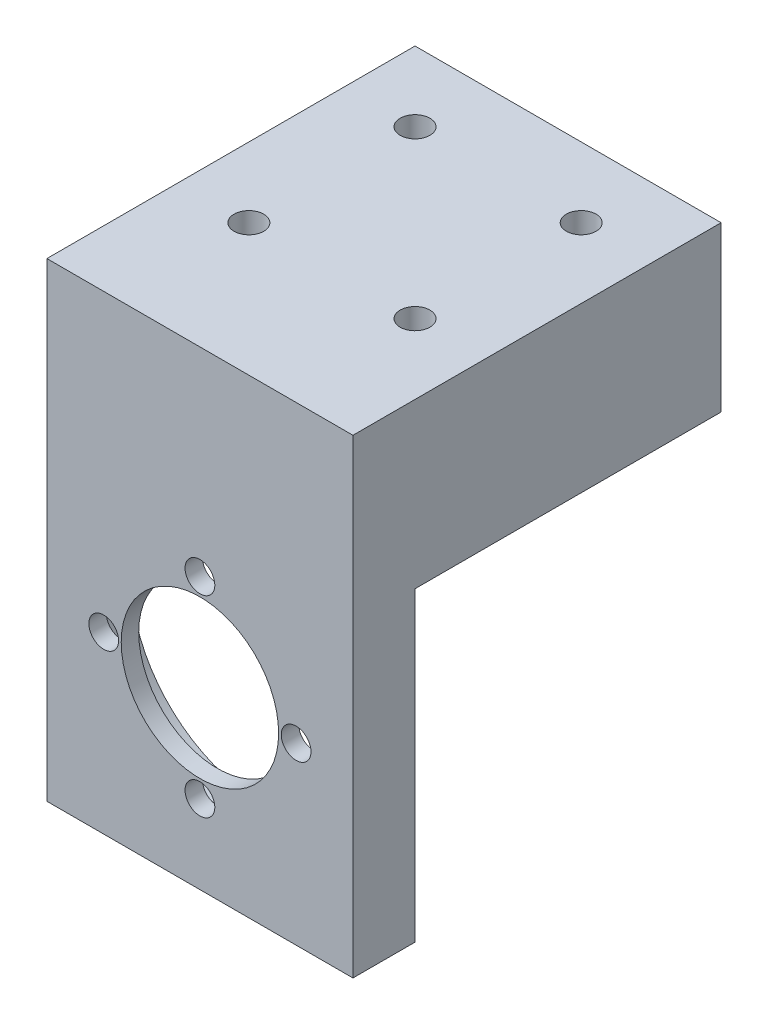
ISO-10303-21;
HEADER;
FILE_DESCRIPTION(('STEP AP214'),'2;1');
FILE_NAME('part.step','',(''),(''),'','','');
FILE_SCHEMA(('AUTOMOTIVE_DESIGN { 1 0 10303 214 1 1 1 1 }'));
ENDSEC;
DATA;
#1=APPLICATION_CONTEXT('core data for automotive mechanical design processes');
#2=APPLICATION_PROTOCOL_DEFINITION('international standard','automotive_design',2000,#1);
#3=PRODUCT_CONTEXT('',#1,'mechanical');
#4=PRODUCT('Part','Part','',(#3));
#5=PRODUCT_RELATED_PRODUCT_CATEGORY('part','',(#4));
#6=PRODUCT_DEFINITION_FORMATION('','',#4);
#7=PRODUCT_DEFINITION_CONTEXT('part definition',#1,'design');
#8=PRODUCT_DEFINITION('design','',#6,#7);
#9=PRODUCT_DEFINITION_SHAPE('','',#8);
#10=(LENGTH_UNIT() NAMED_UNIT(*) SI_UNIT(.MILLI.,.METRE.));
#11=(NAMED_UNIT(*) PLANE_ANGLE_UNIT() SI_UNIT($,.RADIAN.));
#12=(NAMED_UNIT(*) SI_UNIT($,.STERADIAN.) SOLID_ANGLE_UNIT());
#13=UNCERTAINTY_MEASURE_WITH_UNIT(LENGTH_MEASURE(1.E-05),#10,'distance_accuracy_value','');
#14=(GEOMETRIC_REPRESENTATION_CONTEXT(3) GLOBAL_UNCERTAINTY_ASSIGNED_CONTEXT((#13)) GLOBAL_UNIT_ASSIGNED_CONTEXT((#10,
#11,#12)) REPRESENTATION_CONTEXT('',''));
#15=CARTESIAN_POINT('',(0.,0.,0.));
#16=DIRECTION('',(0.,0.,1.));
#17=DIRECTION('',(1.,0.,0.));
#18=AXIS2_PLACEMENT_3D('',#15,#16,#17);
#19=CARTESIAN_POINT('',(35.,53.75,0.));
#20=DIRECTION('',(0.,0.,-1.));
#21=DIRECTION('',(-1.,0.,0.));
#22=AXIS2_PLACEMENT_3D('',#19,#20,#21);
#23=PLANE('',#22);
#24=CARTESIAN_POINT('',(6.5,20.,0.));
#25=DIRECTION('',(0.,0.,-1.));
#26=DIRECTION('',(-1.,0.,0.));
#27=AXIS2_PLACEMENT_3D('',#24,#25,#26);
#28=CIRCLE('',#27,1.69999999999999);
#29=CARTESIAN_POINT('',(4.80000000000001,20.,0.));
#30=VERTEX_POINT('',#29);
#31=EDGE_CURVE('E204',#30,#30,#28,.T.);
#32=ORIENTED_EDGE('',*,*,#31,.T.);
#33=EDGE_LOOP('',(#32));
#34=FACE_BOUND('',#33,.T.);
#35=CARTESIAN_POINT('',(17.5,20.,0.));
#36=DIRECTION('',(0.,0.,-1.));
#37=DIRECTION('',(-1.,0.,0.));
#38=AXIS2_PLACEMENT_3D('',#35,#36,#37);
#39=CIRCLE('',#38,9.);
#40=CARTESIAN_POINT('',(8.5,20.,0.));
#41=VERTEX_POINT('',#40);
#42=EDGE_CURVE('E253',#41,#41,#39,.T.);
#43=ORIENTED_EDGE('',*,*,#42,.T.);
#44=EDGE_LOOP('',(#43));
#45=FACE_BOUND('',#44,.T.);
#46=CARTESIAN_POINT('',(17.5,31.,0.));
#47=DIRECTION('',(0.,0.,-1.));
#48=DIRECTION('',(-1.,0.,0.));
#49=AXIS2_PLACEMENT_3D('',#46,#47,#48);
#50=CIRCLE('',#49,1.7);
#51=CARTESIAN_POINT('',(15.8,31.,0.));
#52=VERTEX_POINT('',#51);
#53=EDGE_CURVE('E249',#52,#52,#50,.T.);
#54=ORIENTED_EDGE('',*,*,#53,.T.);
#55=EDGE_LOOP('',(#54));
#56=FACE_BOUND('',#55,.T.);
#57=CARTESIAN_POINT('',(28.5,20.,0.));
#58=DIRECTION('',(0.,0.,-1.));
#59=DIRECTION('',(-1.,0.,0.));
#60=AXIS2_PLACEMENT_3D('',#57,#58,#59);
#61=CIRCLE('',#60,1.7);
#62=CARTESIAN_POINT('',(26.8,20.,0.));
#63=VERTEX_POINT('',#62);
#64=EDGE_CURVE('E243',#63,#63,#61,.T.);
#65=ORIENTED_EDGE('',*,*,#64,.T.);
#66=EDGE_LOOP('',(#65));
#67=FACE_BOUND('',#66,.T.);
#68=CARTESIAN_POINT('',(17.5,9.,0.));
#69=DIRECTION('',(0.,0.,-1.));
#70=DIRECTION('',(-1.,0.,0.));
#71=AXIS2_PLACEMENT_3D('',#68,#69,#70);
#72=CIRCLE('',#71,1.7);
#73=CARTESIAN_POINT('',(15.8,9.,0.));
#74=VERTEX_POINT('',#73);
#75=EDGE_CURVE('E248',#74,#74,#72,.T.);
#76=ORIENTED_EDGE('',*,*,#75,.T.);
#77=EDGE_LOOP('',(#76));
#78=FACE_BOUND('',#77,.T.);
#79=DIRECTION('',(0.,-1.,0.));
#80=VECTOR('',#79,1.);
#81=CARTESIAN_POINT('',(0.,53.75,0.));
#82=LINE('',#81,#80);
#83=CARTESIAN_POINT('',(0.,53.75,0.));
#84=VERTEX_POINT('',#83);
#85=CARTESIAN_POINT('',(0.,0.,0.));
#86=VERTEX_POINT('',#85);
#87=EDGE_CURVE('E199',#84,#86,#82,.T.);
#88=ORIENTED_EDGE('',*,*,#87,.T.);
#89=DIRECTION('',(-1.,0.,0.));
#90=VECTOR('',#89,1.);
#91=CARTESIAN_POINT('',(35.,0.,0.));
#92=LINE('',#91,#90);
#93=CARTESIAN_POINT('',(35.,0.,0.));
#94=VERTEX_POINT('',#93);
#95=EDGE_CURVE('E12',#94,#86,#92,.T.);
#96=ORIENTED_EDGE('',*,*,#95,.F.);
#97=DIRECTION('',(0.,-1.,0.));
#98=VECTOR('',#97,1.);
#99=CARTESIAN_POINT('',(35.,53.75,0.));
#100=LINE('',#99,#98);
#101=CARTESIAN_POINT('',(35.,53.75,0.));
#102=VERTEX_POINT('',#101);
#103=EDGE_CURVE('E218',#102,#94,#100,.T.);
#104=ORIENTED_EDGE('',*,*,#103,.F.);
#105=DIRECTION('',(-1.,0.,0.));
#106=VECTOR('',#105,1.);
#107=CARTESIAN_POINT('',(35.,53.75,0.));
#108=LINE('',#107,#106);
#109=EDGE_CURVE('E195',#102,#84,#108,.T.);
#110=ORIENTED_EDGE('',*,*,#109,.T.);
#111=EDGE_LOOP('',(#88,#96,#104,#110));
#112=FACE_BOUND('',#111,.T.);
#113=ADVANCED_FACE('F105',(#34,#45,#56,#67,#78,#112),#23,.F.);
#114=CARTESIAN_POINT('',(35.,0.,0.));
#115=DIRECTION('',(0.,1.,0.));
#116=DIRECTION('',(0.,0.,1.));
#117=AXIS2_PLACEMENT_3D('',#114,#115,#116);
#118=PLANE('',#117);
#119=DIRECTION('',(0.,0.,-1.));
#120=VECTOR('',#119,1.);
#121=CARTESIAN_POINT('',(0.,0.,0.));
#122=LINE('',#121,#120);
#123=CARTESIAN_POINT('',(0.,0.,-7.1));
#124=VERTEX_POINT('',#123);
#125=EDGE_CURVE('E203',#86,#124,#122,.T.);
#126=ORIENTED_EDGE('',*,*,#125,.T.);
#127=DIRECTION('',(-1.,0.,0.));
#128=VECTOR('',#127,1.);
#129=CARTESIAN_POINT('',(35.,0.,-7.1));
#130=LINE('',#129,#128);
#131=CARTESIAN_POINT('',(35.,0.,-7.1));
#132=VERTEX_POINT('',#131);
#133=EDGE_CURVE('E113',#132,#124,#130,.T.);
#134=ORIENTED_EDGE('',*,*,#133,.F.);
#135=DIRECTION('',(0.,0.,-1.));
#136=VECTOR('',#135,1.);
#137=CARTESIAN_POINT('',(35.,0.,0.));
#138=LINE('',#137,#136);
#139=EDGE_CURVE('E160',#94,#132,#138,.T.);
#140=ORIENTED_EDGE('',*,*,#139,.F.);
#141=ORIENTED_EDGE('',*,*,#95,.T.);
#142=EDGE_LOOP('',(#126,#134,#140,#141));
#143=FACE_BOUND('',#142,.T.);
#144=ADVANCED_FACE('F349',(#143),#118,.F.);
#145=CARTESIAN_POINT('',(35.,0.,-7.1));
#146=DIRECTION('',(0.,0.,1.));
#147=DIRECTION('',(1.,0.,0.));
#148=AXIS2_PLACEMENT_3D('',#145,#146,#147);
#149=PLANE('',#148);
#150=DIRECTION('',(-1.,0.,0.));
#151=VECTOR('',#150,1.);
#152=CARTESIAN_POINT('',(35.,35.,-7.1));
#153=LINE('',#152,#151);
#154=CARTESIAN_POINT('',(17.5,35.,-7.1));
#155=VERTEX_POINT('',#154);
#156=CARTESIAN_POINT('',(0.,35.,-7.1));
#157=VERTEX_POINT('',#156);
#158=EDGE_CURVE('E188',#155,#157,#153,.T.);
#159=ORIENTED_EDGE('',*,*,#158,.F.);
#160=CARTESIAN_POINT('',(17.5,20.,-7.1));
#161=DIRECTION('',(0.,0.,1.));
#162=DIRECTION('',(1.,0.,0.));
#163=AXIS2_PLACEMENT_3D('',#160,#161,#162);
#164=CIRCLE('',#163,15.);
#165=EDGE_CURVE('E118',#155,#155,#164,.T.);
#166=ORIENTED_EDGE('',*,*,#165,.T.);
#167=CARTESIAN_POINT('',(35.,35.,-7.1));
#168=VERTEX_POINT('',#167);
#169=EDGE_CURVE('E223',#168,#155,#153,.T.);
#170=ORIENTED_EDGE('',*,*,#169,.F.);
#171=DIRECTION('',(0.,1.,0.));
#172=VECTOR('',#171,1.);
#173=CARTESIAN_POINT('',(35.,0.,-7.1));
#174=LINE('',#173,#172);
#175=EDGE_CURVE('E174',#132,#168,#174,.T.);
#176=ORIENTED_EDGE('',*,*,#175,.F.);
#177=ORIENTED_EDGE('',*,*,#133,.T.);
#178=DIRECTION('',(0.,1.,0.));
#179=VECTOR('',#178,1.);
#180=CARTESIAN_POINT('',(0.,0.,-7.1));
#181=LINE('',#180,#179);
#182=EDGE_CURVE('E207',#124,#157,#181,.T.);
#183=ORIENTED_EDGE('',*,*,#182,.T.);
#184=EDGE_LOOP('',(#159,#166,#170,#176,#177,#183));
#185=FACE_BOUND('',#184,.T.);
#186=ADVANCED_FACE('F230',(#185),#149,.F.);
#187=CARTESIAN_POINT('',(35.,35.,-7.1));
#188=DIRECTION('',(0.,1.,0.));
#189=DIRECTION('',(0.,0.,1.));
#190=AXIS2_PLACEMENT_3D('',#187,#188,#189);
#191=PLANE('',#190);
#192=CARTESIAN_POINT('',(8.,35.,-34.1));
#193=DIRECTION('',(0.,-1.,0.));
#194=DIRECTION('',(0.,0.,1.));
#195=AXIS2_PLACEMENT_3D('',#192,#193,#194);
#196=CIRCLE('',#195,1.7);
#197=CARTESIAN_POINT('',(8.,35.,-32.4));
#198=VERTEX_POINT('',#197);
#199=EDGE_CURVE('E302',#198,#198,#196,.T.);
#200=ORIENTED_EDGE('',*,*,#199,.F.);
#201=EDGE_LOOP('',(#200));
#202=FACE_BOUND('',#201,.T.);
#203=CARTESIAN_POINT('',(27.,35.,-34.1));
#204=DIRECTION('',(0.,-1.,0.));
#205=DIRECTION('',(0.,0.,-1.));
#206=AXIS2_PLACEMENT_3D('',#203,#204,#205);
#207=CIRCLE('',#206,1.7);
#208=CARTESIAN_POINT('',(27.,35.,-35.8));
#209=VERTEX_POINT('',#208);
#210=EDGE_CURVE('E310',#209,#209,#207,.T.);
#211=ORIENTED_EDGE('',*,*,#210,.F.);
#212=EDGE_LOOP('',(#211));
#213=FACE_BOUND('',#212,.T.);
#214=CARTESIAN_POINT('',(27.,35.,-15.1));
#215=DIRECTION('',(0.,-1.,0.));
#216=DIRECTION('',(0.,0.,1.));
#217=AXIS2_PLACEMENT_3D('',#214,#215,#216);
#218=CIRCLE('',#217,1.7);
#219=CARTESIAN_POINT('',(27.,35.,-13.4));
#220=VERTEX_POINT('',#219);
#221=EDGE_CURVE('E294',#220,#220,#218,.T.);
#222=ORIENTED_EDGE('',*,*,#221,.F.);
#223=EDGE_LOOP('',(#222));
#224=FACE_BOUND('',#223,.T.);
#225=CARTESIAN_POINT('',(8.,35.,-15.1));
#226=DIRECTION('',(0.,-1.,0.));
#227=DIRECTION('',(0.,0.,-1.));
#228=AXIS2_PLACEMENT_3D('',#225,#226,#227);
#229=CIRCLE('',#228,1.7);
#230=CARTESIAN_POINT('',(8.,35.,-16.8));
#231=VERTEX_POINT('',#230);
#232=EDGE_CURVE('E290',#231,#231,#229,.T.);
#233=ORIENTED_EDGE('',*,*,#232,.F.);
#234=EDGE_LOOP('',(#233));
#235=FACE_BOUND('',#234,.T.);
#236=DIRECTION('',(0.,0.,-1.));
#237=VECTOR('',#236,1.);
#238=CARTESIAN_POINT('',(0.,35.,-7.1));
#239=LINE('',#238,#237);
#240=CARTESIAN_POINT('',(0.,35.,-42.1));
#241=VERTEX_POINT('',#240);
#242=EDGE_CURVE('E184',#157,#241,#239,.T.);
#243=ORIENTED_EDGE('',*,*,#242,.T.);
#244=DIRECTION('',(-1.,0.,0.));
#245=VECTOR('',#244,1.);
#246=CARTESIAN_POINT('',(35.,35.,-42.1));
#247=LINE('',#246,#245);
#248=CARTESIAN_POINT('',(35.,35.,-42.1));
#249=VERTEX_POINT('',#248);
#250=EDGE_CURVE('E181',#249,#241,#247,.T.);
#251=ORIENTED_EDGE('',*,*,#250,.F.);
#252=DIRECTION('',(0.,0.,-1.));
#253=VECTOR('',#252,1.);
#254=CARTESIAN_POINT('',(35.,35.,-7.1));
#255=LINE('',#254,#253);
#256=EDGE_CURVE('E167',#168,#249,#255,.T.);
#257=ORIENTED_EDGE('',*,*,#256,.F.);
#258=ORIENTED_EDGE('',*,*,#169,.T.);
#259=ORIENTED_EDGE('',*,*,#158,.T.);
#260=EDGE_LOOP('',(#243,#251,#257,#258,#259));
#261=FACE_BOUND('',#260,.T.);
#262=ADVANCED_FACE('F182',(#202,#213,#224,#235,#261),#191,.F.);
#263=CARTESIAN_POINT('',(35.,35.,-42.1));
#264=DIRECTION('',(0.,0.,1.));
#265=DIRECTION('',(1.,0.,0.));
#266=AXIS2_PLACEMENT_3D('',#263,#264,#265);
#267=PLANE('',#266);
#268=DIRECTION('',(0.,1.,0.));
#269=VECTOR('',#268,1.);
#270=CARTESIAN_POINT('',(0.,35.,-42.1));
#271=LINE('',#270,#269);
#272=CARTESIAN_POINT('',(0.,53.75,-42.1));
#273=VERTEX_POINT('',#272);
#274=EDGE_CURVE('E213',#241,#273,#271,.T.);
#275=ORIENTED_EDGE('',*,*,#274,.T.);
#276=DIRECTION('',(-1.,0.,0.));
#277=VECTOR('',#276,1.);
#278=CARTESIAN_POINT('',(35.,53.75,-42.1));
#279=LINE('',#278,#277);
#280=CARTESIAN_POINT('',(35.,53.75,-42.1));
#281=VERTEX_POINT('',#280);
#282=EDGE_CURVE('E189',#281,#273,#279,.T.);
#283=ORIENTED_EDGE('',*,*,#282,.F.);
#284=DIRECTION('',(0.,1.,0.));
#285=VECTOR('',#284,1.);
#286=CARTESIAN_POINT('',(35.,35.,-42.1));
#287=LINE('',#286,#285);
#288=EDGE_CURVE('E171',#249,#281,#287,.T.);
#289=ORIENTED_EDGE('',*,*,#288,.F.);
#290=ORIENTED_EDGE('',*,*,#250,.T.);
#291=EDGE_LOOP('',(#275,#283,#289,#290));
#292=FACE_BOUND('',#291,.T.);
#293=ADVANCED_FACE('F191',(#292),#267,.F.);
#294=CARTESIAN_POINT('',(35.,53.75,-42.1));
#295=DIRECTION('',(0.,-1.,0.));
#296=DIRECTION('',(0.,0.,-1.));
#297=AXIS2_PLACEMENT_3D('',#294,#295,#296);
#298=PLANE('',#297);
#299=CARTESIAN_POINT('',(8.,53.75,-34.1));
#300=DIRECTION('',(0.,-1.,0.));
#301=DIRECTION('',(0.,0.,1.));
#302=AXIS2_PLACEMENT_3D('',#299,#300,#301);
#303=CIRCLE('',#302,1.7);
#304=CARTESIAN_POINT('',(8.,53.75,-32.4));
#305=VERTEX_POINT('',#304);
#306=EDGE_CURVE('E298',#305,#305,#303,.T.);
#307=ORIENTED_EDGE('',*,*,#306,.T.);
#308=EDGE_LOOP('',(#307));
#309=FACE_BOUND('',#308,.T.);
#310=CARTESIAN_POINT('',(27.,53.75,-34.1));
#311=DIRECTION('',(0.,-1.,0.));
#312=DIRECTION('',(0.,0.,-1.));
#313=AXIS2_PLACEMENT_3D('',#310,#311,#312);
#314=CIRCLE('',#313,1.7);
#315=CARTESIAN_POINT('',(27.,53.75,-35.8));
#316=VERTEX_POINT('',#315);
#317=EDGE_CURVE('E306',#316,#316,#314,.T.);
#318=ORIENTED_EDGE('',*,*,#317,.T.);
#319=EDGE_LOOP('',(#318));
#320=FACE_BOUND('',#319,.T.);
#321=CARTESIAN_POINT('',(27.,53.75,-15.1));
#322=DIRECTION('',(0.,-1.,0.));
#323=DIRECTION('',(0.,0.,1.));
#324=AXIS2_PLACEMENT_3D('',#321,#322,#323);
#325=CIRCLE('',#324,1.7);
#326=CARTESIAN_POINT('',(27.,53.75,-13.4));
#327=VERTEX_POINT('',#326);
#328=EDGE_CURVE('E314',#327,#327,#325,.T.);
#329=ORIENTED_EDGE('',*,*,#328,.T.);
#330=EDGE_LOOP('',(#329));
#331=FACE_BOUND('',#330,.T.);
#332=CARTESIAN_POINT('',(8.,53.75,-15.1));
#333=DIRECTION('',(0.,-1.,0.));
#334=DIRECTION('',(0.,0.,-1.));
#335=AXIS2_PLACEMENT_3D('',#332,#333,#334);
#336=CIRCLE('',#335,1.7);
#337=CARTESIAN_POINT('',(8.,53.75,-16.8));
#338=VERTEX_POINT('',#337);
#339=EDGE_CURVE('E289',#338,#338,#336,.T.);
#340=ORIENTED_EDGE('',*,*,#339,.T.);
#341=EDGE_LOOP('',(#340));
#342=FACE_BOUND('',#341,.T.);
#343=DIRECTION('',(0.,0.,1.));
#344=VECTOR('',#343,1.);
#345=CARTESIAN_POINT('',(0.,53.75,-42.1));
#346=LINE('',#345,#344);
#347=EDGE_CURVE('E152',#273,#84,#346,.T.);
#348=ORIENTED_EDGE('',*,*,#347,.T.);
#349=ORIENTED_EDGE('',*,*,#109,.F.);
#350=DIRECTION('',(0.,0.,1.));
#351=VECTOR('',#350,1.);
#352=CARTESIAN_POINT('',(35.,53.75,-42.1));
#353=LINE('',#352,#351);
#354=EDGE_CURVE('E126',#281,#102,#353,.T.);
#355=ORIENTED_EDGE('',*,*,#354,.F.);
#356=ORIENTED_EDGE('',*,*,#282,.T.);
#357=EDGE_LOOP('',(#348,#349,#355,#356));
#358=FACE_BOUND('',#357,.T.);
#359=ADVANCED_FACE('F234',(#309,#320,#331,#342,#358),#298,.F.);
#360=CARTESIAN_POINT('',(35.,0.,0.));
#361=DIRECTION('',(1.,0.,0.));
#362=DIRECTION('',(0.,0.,-1.));
#363=AXIS2_PLACEMENT_3D('',#360,#361,#362);
#364=PLANE('',#363);
#365=ORIENTED_EDGE('',*,*,#103,.T.);
#366=ORIENTED_EDGE('',*,*,#139,.T.);
#367=ORIENTED_EDGE('',*,*,#175,.T.);
#368=ORIENTED_EDGE('',*,*,#256,.T.);
#369=ORIENTED_EDGE('',*,*,#288,.T.);
#370=ORIENTED_EDGE('',*,*,#354,.T.);
#371=EDGE_LOOP('',(#365,#366,#367,#368,#369,#370));
#372=FACE_BOUND('',#371,.T.);
#373=ADVANCED_FACE('F169',(#372),#364,.T.);
#374=CARTESIAN_POINT('',(0.,0.,0.));
#375=DIRECTION('',(1.,0.,0.));
#376=DIRECTION('',(0.,0.,-1.));
#377=AXIS2_PLACEMENT_3D('',#374,#375,#376);
#378=PLANE('',#377);
#379=ORIENTED_EDGE('',*,*,#87,.F.);
#380=ORIENTED_EDGE('',*,*,#347,.F.);
#381=ORIENTED_EDGE('',*,*,#274,.F.);
#382=ORIENTED_EDGE('',*,*,#242,.F.);
#383=ORIENTED_EDGE('',*,*,#182,.F.);
#384=ORIENTED_EDGE('',*,*,#125,.F.);
#385=EDGE_LOOP('',(#379,#380,#381,#382,#383,#384));
#386=FACE_BOUND('',#385,.T.);
#387=ADVANCED_FACE('F233',(#386),#378,.F.);
#388=CARTESIAN_POINT('',(17.5,9.,25.4558441227157));
#389=DIRECTION('',(0.,0.,-1.));
#390=DIRECTION('',(-1.,0.,0.));
#391=AXIS2_PLACEMENT_3D('',#388,#389,#390);
#392=CYLINDRICAL_SURFACE('',#391,1.7);
#393=CARTESIAN_POINT('',(17.5,9.,-2.));
#394=DIRECTION('',(0.,0.,1.));
#395=DIRECTION('',(1.,0.,0.));
#396=AXIS2_PLACEMENT_3D('',#393,#394,#395);
#397=CIRCLE('',#396,1.7);
#398=CARTESIAN_POINT('',(19.2,9.,-2.));
#399=VERTEX_POINT('',#398);
#400=EDGE_CURVE('E281',#399,#399,#397,.T.);
#401=ORIENTED_EDGE('',*,*,#400,.F.);
#402=EDGE_LOOP('',(#401));
#403=FACE_BOUND('',#402,.T.);
#404=ORIENTED_EDGE('',*,*,#75,.F.);
#405=EDGE_LOOP('',(#404));
#406=FACE_BOUND('',#405,.T.);
#407=ADVANCED_FACE('F366',(#403,#406),#392,.F.);
#408=CARTESIAN_POINT('',(28.5,20.,25.4558441227157));
#409=DIRECTION('',(0.,0.,-1.));
#410=DIRECTION('',(-1.,0.,0.));
#411=AXIS2_PLACEMENT_3D('',#408,#409,#410);
#412=CYLINDRICAL_SURFACE('',#411,1.7);
#413=CARTESIAN_POINT('',(28.5,20.,-2.));
#414=DIRECTION('',(0.,0.,1.));
#415=DIRECTION('',(1.,0.,0.));
#416=AXIS2_PLACEMENT_3D('',#413,#414,#415);
#417=CIRCLE('',#416,1.7);
#418=CARTESIAN_POINT('',(30.2,20.,-2.));
#419=VERTEX_POINT('',#418);
#420=EDGE_CURVE('E277',#419,#419,#417,.T.);
#421=ORIENTED_EDGE('',*,*,#420,.F.);
#422=EDGE_LOOP('',(#421));
#423=FACE_BOUND('',#422,.T.);
#424=ORIENTED_EDGE('',*,*,#64,.F.);
#425=EDGE_LOOP('',(#424));
#426=FACE_BOUND('',#425,.T.);
#427=ADVANCED_FACE('F368',(#423,#426),#412,.F.);
#428=CARTESIAN_POINT('',(17.5,31.,25.4558441227157));
#429=DIRECTION('',(0.,0.,-1.));
#430=DIRECTION('',(-1.,0.,0.));
#431=AXIS2_PLACEMENT_3D('',#428,#429,#430);
#432=CYLINDRICAL_SURFACE('',#431,1.7);
#433=CARTESIAN_POINT('',(17.5,31.,-2.));
#434=DIRECTION('',(0.,0.,1.));
#435=DIRECTION('',(1.,0.,0.));
#436=AXIS2_PLACEMENT_3D('',#433,#434,#435);
#437=CIRCLE('',#436,1.7);
#438=CARTESIAN_POINT('',(19.2,31.,-2.));
#439=VERTEX_POINT('',#438);
#440=EDGE_CURVE('E273',#439,#439,#437,.T.);
#441=ORIENTED_EDGE('',*,*,#440,.F.);
#442=EDGE_LOOP('',(#441));
#443=FACE_BOUND('',#442,.T.);
#444=ORIENTED_EDGE('',*,*,#53,.F.);
#445=EDGE_LOOP('',(#444));
#446=FACE_BOUND('',#445,.T.);
#447=ADVANCED_FACE('F375',(#443,#446),#432,.F.);
#448=CARTESIAN_POINT('',(17.5,20.,25.4558441227157));
#449=DIRECTION('',(0.,0.,-1.));
#450=DIRECTION('',(-1.,0.,0.));
#451=AXIS2_PLACEMENT_3D('',#448,#449,#450);
#452=CYLINDRICAL_SURFACE('',#451,9.);
#453=CARTESIAN_POINT('',(17.5,20.,-2.));
#454=DIRECTION('',(0.,0.,1.));
#455=DIRECTION('',(1.,0.,0.));
#456=AXIS2_PLACEMENT_3D('',#453,#454,#455);
#457=CIRCLE('',#456,9.);
#458=CARTESIAN_POINT('',(26.5,20.,-2.));
#459=VERTEX_POINT('',#458);
#460=EDGE_CURVE('E269',#459,#459,#457,.T.);
#461=ORIENTED_EDGE('',*,*,#460,.F.);
#462=EDGE_LOOP('',(#461));
#463=FACE_BOUND('',#462,.T.);
#464=ORIENTED_EDGE('',*,*,#42,.F.);
#465=EDGE_LOOP('',(#464));
#466=FACE_BOUND('',#465,.T.);
#467=ADVANCED_FACE('F381',(#463,#466),#452,.F.);
#468=CARTESIAN_POINT('',(6.5,20.,25.4558441227157));
#469=DIRECTION('',(0.,0.,-1.));
#470=DIRECTION('',(-1.,0.,0.));
#471=AXIS2_PLACEMENT_3D('',#468,#469,#470);
#472=CYLINDRICAL_SURFACE('',#471,1.69999999999999);
#473=CARTESIAN_POINT('',(6.5,20.,-2.));
#474=DIRECTION('',(0.,0.,1.));
#475=DIRECTION('',(1.,0.,0.));
#476=AXIS2_PLACEMENT_3D('',#473,#474,#475);
#477=CIRCLE('',#476,1.69999999999999);
#478=CARTESIAN_POINT('',(8.2,20.,-2.));
#479=VERTEX_POINT('',#478);
#480=EDGE_CURVE('E285',#479,#479,#477,.T.);
#481=ORIENTED_EDGE('',*,*,#480,.F.);
#482=EDGE_LOOP('',(#481));
#483=FACE_BOUND('',#482,.T.);
#484=ORIENTED_EDGE('',*,*,#31,.F.);
#485=EDGE_LOOP('',(#484));
#486=FACE_BOUND('',#485,.T.);
#487=ADVANCED_FACE('F447',(#483,#486),#472,.F.);
#488=CARTESIAN_POINT('',(17.5,20.,-84.5264068711928));
#489=DIRECTION('',(0.,0.,1.));
#490=DIRECTION('',(1.,0.,0.));
#491=AXIS2_PLACEMENT_3D('',#488,#489,#490);
#492=CYLINDRICAL_SURFACE('',#491,15.);
#493=CARTESIAN_POINT('',(17.5,20.,-2.));
#494=DIRECTION('',(0.,0.,1.));
#495=DIRECTION('',(1.,0.,0.));
#496=AXIS2_PLACEMENT_3D('',#493,#494,#495);
#497=CIRCLE('',#496,15.);
#498=CARTESIAN_POINT('',(32.5,20.,-2.));
#499=VERTEX_POINT('',#498);
#500=EDGE_CURVE('E265',#499,#499,#497,.T.);
#501=ORIENTED_EDGE('',*,*,#500,.T.);
#502=EDGE_LOOP('',(#501));
#503=FACE_BOUND('',#502,.T.);
#504=ORIENTED_EDGE('',*,*,#165,.F.);
#505=EDGE_LOOP('',(#504));
#506=FACE_BOUND('',#505,.T.);
#507=ADVANCED_FACE('F343',(#503,#506),#492,.F.);
#508=CARTESIAN_POINT('',(17.5,20.,-2.));
#509=DIRECTION('',(0.,0.,1.));
#510=DIRECTION('',(1.,0.,0.));
#511=AXIS2_PLACEMENT_3D('',#508,#509,#510);
#512=PLANE('',#511);
#513=ORIENTED_EDGE('',*,*,#400,.T.);
#514=EDGE_LOOP('',(#513));
#515=FACE_BOUND('',#514,.T.);
#516=ORIENTED_EDGE('',*,*,#440,.T.);
#517=EDGE_LOOP('',(#516));
#518=FACE_BOUND('',#517,.T.);
#519=ORIENTED_EDGE('',*,*,#500,.F.);
#520=EDGE_LOOP('',(#519));
#521=FACE_BOUND('',#520,.T.);
#522=ORIENTED_EDGE('',*,*,#460,.T.);
#523=EDGE_LOOP('',(#522));
#524=FACE_BOUND('',#523,.T.);
#525=ORIENTED_EDGE('',*,*,#420,.T.);
#526=EDGE_LOOP('',(#525));
#527=FACE_BOUND('',#526,.T.);
#528=ORIENTED_EDGE('',*,*,#480,.T.);
#529=EDGE_LOOP('',(#528));
#530=FACE_BOUND('',#529,.T.);
#531=ADVANCED_FACE('F332',(#515,#518,#521,#524,#527,#530),#512,.F.);
#532=CARTESIAN_POINT('',(8.,53.75,-15.1));
#533=DIRECTION('',(0.,-1.,0.));
#534=DIRECTION('',(0.,0.,-1.));
#535=AXIS2_PLACEMENT_3D('',#532,#533,#534);
#536=CYLINDRICAL_SURFACE('',#535,1.7);
#537=ORIENTED_EDGE('',*,*,#339,.F.);
#538=EDGE_LOOP('',(#537));
#539=FACE_BOUND('',#538,.T.);
#540=ORIENTED_EDGE('',*,*,#232,.T.);
#541=EDGE_LOOP('',(#540));
#542=FACE_BOUND('',#541,.T.);
#543=ADVANCED_FACE('F330',(#539,#542),#536,.F.);
#544=CARTESIAN_POINT('',(27.,53.75,-15.1));
#545=DIRECTION('',(0.,-1.,0.));
#546=DIRECTION('',(0.,0.,-1.));
#547=AXIS2_PLACEMENT_3D('',#544,#545,#546);
#548=CYLINDRICAL_SURFACE('',#547,1.7);
#549=ORIENTED_EDGE('',*,*,#328,.F.);
#550=EDGE_LOOP('',(#549));
#551=FACE_BOUND('',#550,.T.);
#552=ORIENTED_EDGE('',*,*,#221,.T.);
#553=EDGE_LOOP('',(#552));
#554=FACE_BOUND('',#553,.T.);
#555=ADVANCED_FACE('F322',(#551,#554),#548,.F.);
#556=CARTESIAN_POINT('',(27.,53.75,-34.1));
#557=DIRECTION('',(0.,-1.,0.));
#558=DIRECTION('',(0.,0.,-1.));
#559=AXIS2_PLACEMENT_3D('',#556,#557,#558);
#560=CYLINDRICAL_SURFACE('',#559,1.7);
#561=ORIENTED_EDGE('',*,*,#317,.F.);
#562=EDGE_LOOP('',(#561));
#563=FACE_BOUND('',#562,.T.);
#564=ORIENTED_EDGE('',*,*,#210,.T.);
#565=EDGE_LOOP('',(#564));
#566=FACE_BOUND('',#565,.T.);
#567=ADVANCED_FACE('F339',(#563,#566),#560,.F.);
#568=CARTESIAN_POINT('',(8.,53.75,-34.1));
#569=DIRECTION('',(0.,-1.,0.));
#570=DIRECTION('',(0.,0.,-1.));
#571=AXIS2_PLACEMENT_3D('',#568,#569,#570);
#572=CYLINDRICAL_SURFACE('',#571,1.7);
#573=ORIENTED_EDGE('',*,*,#306,.F.);
#574=EDGE_LOOP('',(#573));
#575=FACE_BOUND('',#574,.T.);
#576=ORIENTED_EDGE('',*,*,#199,.T.);
#577=EDGE_LOOP('',(#576));
#578=FACE_BOUND('',#577,.T.);
#579=ADVANCED_FACE('F493',(#575,#578),#572,.F.);
#580=CLOSED_SHELL('',(#113,#144,#186,#262,#293,#359,#373,#387,#407,#427,#447,#467,#487,#507,
#531,#543,#555,#567,#579));
#581=MANIFOLD_SOLID_BREP('B2',#580);
#582=ADVANCED_BREP_SHAPE_REPRESENTATION('',(#18,#581),#14);
#583=SHAPE_DEFINITION_REPRESENTATION(#9,#582);
ENDSEC;
END-ISO-10303-21;
